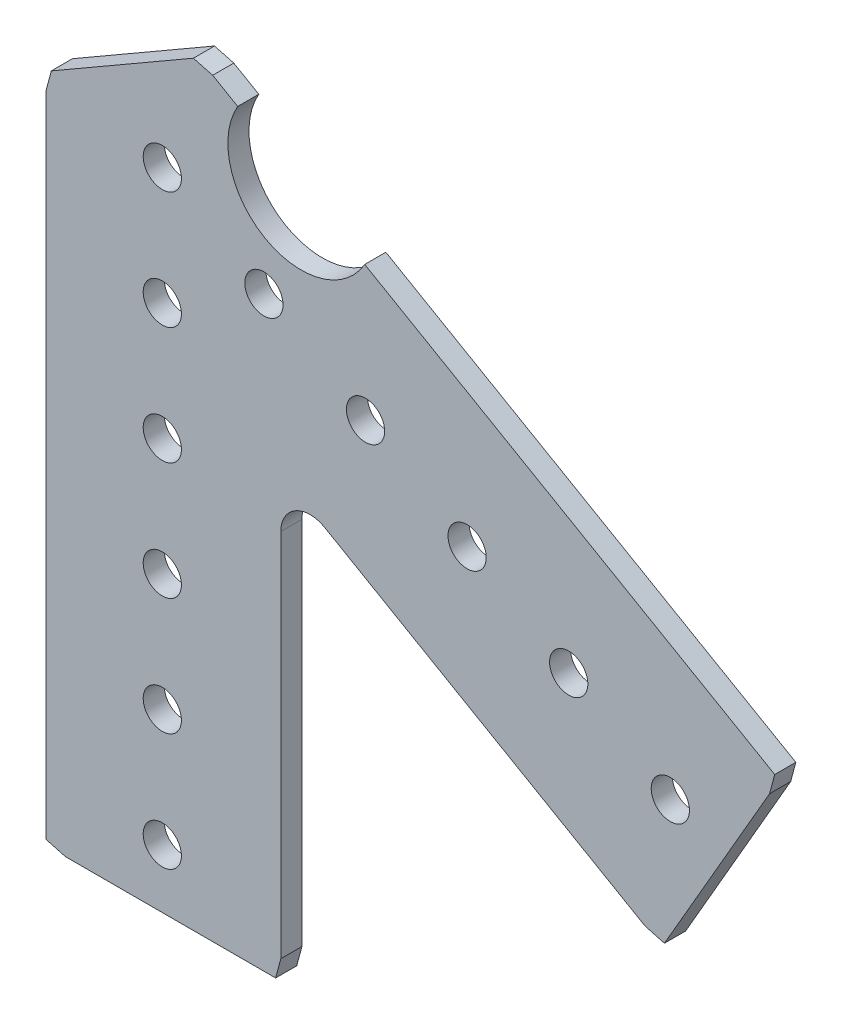
ISO-10303-21;
HEADER;
FILE_DESCRIPTION(('STEP AP214'),'2;1');
FILE_NAME('part.step','',(''),(''),'','','');
FILE_SCHEMA(('AUTOMOTIVE_DESIGN { 1 0 10303 214 1 1 1 1 }'));
ENDSEC;
DATA;
#1=APPLICATION_CONTEXT('core data for automotive mechanical design processes');
#2=APPLICATION_PROTOCOL_DEFINITION('international standard','automotive_design',2000,#1);
#3=PRODUCT_CONTEXT('',#1,'mechanical');
#4=PRODUCT('Part','Part','',(#3));
#5=PRODUCT_RELATED_PRODUCT_CATEGORY('part','',(#4));
#6=PRODUCT_DEFINITION_FORMATION('','',#4);
#7=PRODUCT_DEFINITION_CONTEXT('part definition',#1,'design');
#8=PRODUCT_DEFINITION('design','',#6,#7);
#9=PRODUCT_DEFINITION_SHAPE('','',#8);
#10=(LENGTH_UNIT() NAMED_UNIT(*) SI_UNIT(.MILLI.,.METRE.));
#11=(NAMED_UNIT(*) PLANE_ANGLE_UNIT() SI_UNIT($,.RADIAN.));
#12=(NAMED_UNIT(*) SI_UNIT($,.STERADIAN.) SOLID_ANGLE_UNIT());
#13=UNCERTAINTY_MEASURE_WITH_UNIT(LENGTH_MEASURE(1.E-05),#10,'distance_accuracy_value','');
#14=(GEOMETRIC_REPRESENTATION_CONTEXT(3) GLOBAL_UNCERTAINTY_ASSIGNED_CONTEXT((#13)) GLOBAL_UNIT_ASSIGNED_CONTEXT((#10,
#11,#12)) REPRESENTATION_CONTEXT('',''));
#15=CARTESIAN_POINT('',(0.,0.,0.));
#16=DIRECTION('',(0.,0.,1.));
#17=DIRECTION('',(1.,0.,0.));
#18=AXIS2_PLACEMENT_3D('',#15,#16,#17);
#19=CARTESIAN_POINT('',(66.7783744543378,-24.0364625982182,2.286));
#20=DIRECTION('',(0.,0.,1.));
#21=DIRECTION('',(1.,0.,0.));
#22=AXIS2_PLACEMENT_3D('',#19,#20,#21);
#23=PLANE('',#22);
#24=CARTESIAN_POINT('',(0.,-63.5,2.286));
#25=DIRECTION('',(0.,0.,-1.));
#26=DIRECTION('',(-1.,0.,0.));
#27=AXIS2_PLACEMENT_3D('',#24,#25,#26);
#28=CIRCLE('',#27,2.0701);
#29=CARTESIAN_POINT('',(-2.0701,-63.5,2.286));
#30=VERTEX_POINT('',#29);
#31=EDGE_CURVE('E262',#30,#30,#28,.T.);
#32=ORIENTED_EDGE('',*,*,#31,.T.);
#33=EDGE_LOOP('',(#32));
#34=FACE_BOUND('',#33,.T.);
#35=CARTESIAN_POINT('',(54.9926131403094,-31.75,2.286));
#36=DIRECTION('',(0.,0.,-1.));
#37=DIRECTION('',(-1.,0.,0.));
#38=AXIS2_PLACEMENT_3D('',#35,#36,#37);
#39=CIRCLE('',#38,2.0701);
#40=CARTESIAN_POINT('',(52.9225131403094,-31.75,2.286));
#41=VERTEX_POINT('',#40);
#42=EDGE_CURVE('E265',#41,#41,#39,.T.);
#43=ORIENTED_EDGE('',*,*,#42,.T.);
#44=EDGE_LOOP('',(#43));
#45=FACE_BOUND('',#44,.T.);
#46=CARTESIAN_POINT('',(32.9955678841958,-19.05,2.286));
#47=DIRECTION('',(0.,0.,-1.));
#48=DIRECTION('',(-1.,0.,0.));
#49=AXIS2_PLACEMENT_3D('',#46,#47,#48);
#50=CIRCLE('',#49,2.0701);
#51=CARTESIAN_POINT('',(30.9254678841958,-19.05,2.286));
#52=VERTEX_POINT('',#51);
#53=EDGE_CURVE('E268',#52,#52,#50,.T.);
#54=ORIENTED_EDGE('',*,*,#53,.T.);
#55=EDGE_LOOP('',(#54));
#56=FACE_BOUND('',#55,.T.);
#57=CARTESIAN_POINT('',(0.,-50.8,2.286));
#58=DIRECTION('',(0.,0.,-1.));
#59=DIRECTION('',(-1.,0.,0.));
#60=AXIS2_PLACEMENT_3D('',#57,#58,#59);
#61=CIRCLE('',#60,2.0701);
#62=CARTESIAN_POINT('',(-2.0701,-50.8,2.286));
#63=VERTEX_POINT('',#62);
#64=EDGE_CURVE('E271',#63,#63,#61,.T.);
#65=ORIENTED_EDGE('',*,*,#64,.T.);
#66=EDGE_LOOP('',(#65));
#67=FACE_BOUND('',#66,.T.);
#68=CARTESIAN_POINT('',(2.66050878019862E-13,-25.4,2.286));
#69=DIRECTION('',(0.,0.,-1.));
#70=DIRECTION('',(-1.,0.,0.));
#71=AXIS2_PLACEMENT_3D('',#68,#69,#70);
#72=CIRCLE('',#71,2.0701);
#73=CARTESIAN_POINT('',(-2.07009999999973,-25.4,2.286));
#74=VERTEX_POINT('',#73);
#75=EDGE_CURVE('E274',#74,#74,#72,.T.);
#76=ORIENTED_EDGE('',*,*,#75,.T.);
#77=EDGE_LOOP('',(#76));
#78=FACE_BOUND('',#77,.T.);
#79=CARTESIAN_POINT('',(10.9985226280619,-6.35,2.286));
#80=DIRECTION('',(0.,0.,-1.));
#81=DIRECTION('',(-1.,0.,0.));
#82=AXIS2_PLACEMENT_3D('',#79,#80,#81);
#83=CIRCLE('',#82,2.0701);
#84=CARTESIAN_POINT('',(8.92842262806188,-6.35,2.286));
#85=VERTEX_POINT('',#84);
#86=EDGE_CURVE('E277',#85,#85,#83,.T.);
#87=ORIENTED_EDGE('',*,*,#86,.T.);
#88=EDGE_LOOP('',(#87));
#89=FACE_BOUND('',#88,.T.);
#90=CARTESIAN_POINT('',(0.,0.,2.286));
#91=DIRECTION('',(0.,0.,-1.));
#92=DIRECTION('',(-1.,0.,0.));
#93=AXIS2_PLACEMENT_3D('',#90,#91,#92);
#94=CIRCLE('',#93,2.0701);
#95=CARTESIAN_POINT('',(-2.0701,0.,2.286));
#96=VERTEX_POINT('',#95);
#97=EDGE_CURVE('E280',#96,#96,#94,.T.);
#98=ORIENTED_EDGE('',*,*,#97,.T.);
#99=EDGE_LOOP('',(#98));
#100=FACE_BOUND('',#99,.T.);
#101=CARTESIAN_POINT('',(0.,-12.7,2.286));
#102=DIRECTION('',(0.,0.,-1.));
#103=DIRECTION('',(-1.,0.,0.));
#104=AXIS2_PLACEMENT_3D('',#101,#102,#103);
#105=CIRCLE('',#104,2.0701);
#106=CARTESIAN_POINT('',(-2.0701,-12.7,2.286));
#107=VERTEX_POINT('',#106);
#108=EDGE_CURVE('E283',#107,#107,#105,.T.);
#109=ORIENTED_EDGE('',*,*,#108,.T.);
#110=EDGE_LOOP('',(#109));
#111=FACE_BOUND('',#110,.T.);
#112=CARTESIAN_POINT('',(3.99076317029666E-13,-38.1,2.286));
#113=DIRECTION('',(0.,0.,-1.));
#114=DIRECTION('',(-1.,0.,0.));
#115=AXIS2_PLACEMENT_3D('',#112,#113,#114);
#116=CIRCLE('',#115,2.0701);
#117=CARTESIAN_POINT('',(-2.0700999999996,-38.1,2.286));
#118=VERTEX_POINT('',#117);
#119=EDGE_CURVE('E286',#118,#118,#116,.T.);
#120=ORIENTED_EDGE('',*,*,#119,.T.);
#121=EDGE_LOOP('',(#120));
#122=FACE_BOUND('',#121,.T.);
#123=CARTESIAN_POINT('',(21.9970452561238,-12.7,2.286));
#124=DIRECTION('',(0.,0.,-1.));
#125=DIRECTION('',(-1.,0.,0.));
#126=AXIS2_PLACEMENT_3D('',#123,#124,#125);
#127=CIRCLE('',#126,2.0701);
#128=CARTESIAN_POINT('',(19.9269452561238,-12.7,2.286));
#129=VERTEX_POINT('',#128);
#130=EDGE_CURVE('E146',#129,#129,#127,.T.);
#131=ORIENTED_EDGE('',*,*,#130,.T.);
#132=EDGE_LOOP('',(#131));
#133=FACE_BOUND('',#132,.T.);
#134=CARTESIAN_POINT('',(43.9940905122526,-25.4,2.286));
#135=DIRECTION('',(0.,0.,-1.));
#136=DIRECTION('',(-1.,0.,0.));
#137=AXIS2_PLACEMENT_3D('',#134,#135,#136);
#138=CIRCLE('',#137,2.0701);
#139=CARTESIAN_POINT('',(41.9239905122526,-25.4,2.286));
#140=VERTEX_POINT('',#139);
#141=EDGE_CURVE('E143',#140,#140,#138,.T.);
#142=ORIENTED_EDGE('',*,*,#141,.T.);
#143=EDGE_LOOP('',(#142));
#144=FACE_BOUND('',#143,.T.);
#145=DIRECTION('',(0.866025403784429,-0.500000000000017,0.));
#146=VECTOR('',#145,1.);
#147=CARTESIAN_POINT('',(3.92478394209282,12.2520748035636,2.286));
#148=LINE('',#147,#146);
#149=CARTESIAN_POINT('',(66.2944478432452,-23.7570674390337,2.286));
#150=VERTEX_POINT('',#149);
#151=CARTESIAN_POINT('',(21.9097236802746,1.86846500436471,2.286));
#152=VERTEX_POINT('',#151);
#153=EDGE_CURVE('E138',#150,#152,#148,.F.);
#154=ORIENTED_EDGE('',*,*,#153,.T.);
#155=CARTESIAN_POINT('',(15.0356470377365,5.83721500436554,2.286));
#156=DIRECTION('',(0.,0.,-1.));
#157=DIRECTION('',(-1.,0.,0.));
#158=AXIS2_PLACEMENT_3D('',#155,#156,#157);
#159=CIRCLE('',#158,7.9375);
#160=CARTESIAN_POINT('',(8.16157039519742,9.80596500436463,2.286));
#161=VERTEX_POINT('',#160);
#162=EDGE_CURVE('E19',#152,#161,#159,.T.);
#163=ORIENTED_EDGE('',*,*,#162,.T.);
#164=DIRECTION('',(0.866025403784429,-0.500000000000017,0.));
#165=VECTOR('',#164,1.);
#166=CARTESIAN_POINT('',(3.92478394209282,12.2520748035636,2.286));
#167=LINE('',#166,#165);
#168=CARTESIAN_POINT('',(5.45142748267607,11.3706667444522,2.286));
#169=VERTEX_POINT('',#168);
#170=EDGE_CURVE('E219',#161,#169,#167,.F.);
#171=ORIENTED_EDGE('',*,*,#170,.T.);
#172=DIRECTION('',(0.965925826289076,-0.258819045102493,0.));
#173=VECTOR('',#172,1.);
#174=CARTESIAN_POINT('',(3.2078430840089,11.9718333722264,2.286));
#175=LINE('',#174,#173);
#176=CARTESIAN_POINT('',(3.36599362371692,11.9294570628289,2.286));
#177=VERTEX_POINT('',#176);
#178=EDGE_CURVE('E216',#169,#177,#175,.F.);
#179=ORIENTED_EDGE('',*,*,#178,.T.);
#180=DIRECTION('',(0.866025403784429,0.500000000000017,0.));
#181=VECTOR('',#180,1.);
#182=CARTESIAN_POINT('',(-12.573,2.72707480356364,2.286));
#183=LINE('',#182,#181);
#184=CARTESIAN_POINT('',(-12.0142096816243,3.04969254429852,2.286));
#185=VERTEX_POINT('',#184);
#186=EDGE_CURVE('E211',#177,#185,#183,.F.);
#187=ORIENTED_EDGE('',*,*,#186,.T.);
#188=DIRECTION('',(-0.258819045102493,-0.965925826289076,0.));
#189=VECTOR('',#188,1.);
#190=CARTESIAN_POINT('',(-11.9718333722264,3.2078430840089,2.286));
#191=LINE('',#190,#189);
#192=CARTESIAN_POINT('',(-12.5730000000002,0.964258685340649,2.286));
#193=VERTEX_POINT('',#192);
#194=EDGE_CURVE('E205',#193,#185,#191,.F.);
#195=ORIENTED_EDGE('',*,*,#194,.F.);
#196=DIRECTION('',(0.,1.,0.));
#197=VECTOR('',#196,1.);
#198=CARTESIAN_POINT('',(-12.573,-69.85,2.286));
#199=LINE('',#198,#197);
#200=CARTESIAN_POINT('',(-12.5730000000013,-69.2912096816238,2.286));
#201=VERTEX_POINT('',#200);
#202=EDGE_CURVE('E197',#193,#201,#199,.F.);
#203=ORIENTED_EDGE('',*,*,#202,.T.);
#204=DIRECTION('',(-0.965925826289076,0.258819045102493,0.));
#205=VECTOR('',#204,1.);
#206=CARTESIAN_POINT('',(-18.1650337195145,-67.792828762433,2.286));
#207=LINE('',#206,#205);
#208=CARTESIAN_POINT('',(-10.4875661410412,-69.8500000000003,2.286));
#209=VERTEX_POINT('',#208);
#210=EDGE_CURVE('E194',#201,#209,#207,.F.);
#211=ORIENTED_EDGE('',*,*,#210,.T.);
#212=DIRECTION('',(1.,0.,0.));
#213=VECTOR('',#212,1.);
#214=CARTESIAN_POINT('',(12.827,-69.85,2.286));
#215=LINE('',#214,#213);
#216=CARTESIAN_POINT('',(12.2682096816262,-69.8500000000006,2.286));
#217=VERTEX_POINT('',#216);
#218=EDGE_CURVE('E188',#209,#217,#215,.T.);
#219=ORIENTED_EDGE('',*,*,#218,.T.);
#220=DIRECTION('',(0.258819045102493,0.965925826289076,0.));
#221=VECTOR('',#220,1.);
#222=CARTESIAN_POINT('',(28.9088954624338,-7.7461151932352,2.286));
#223=LINE('',#222,#221);
#224=CARTESIAN_POINT('',(12.8270000000021,-67.7645661410316,2.286));
#225=VERTEX_POINT('',#224);
#226=EDGE_CURVE('E182',#225,#217,#223,.F.);
#227=ORIENTED_EDGE('',*,*,#226,.F.);
#228=DIRECTION('',(0.,1.,0.));
#229=VECTOR('',#228,1.);
#230=CARTESIAN_POINT('',(12.827,0.,2.286));
#231=LINE('',#230,#229);
#232=CARTESIAN_POINT('',(12.827,-27.7162770227072,2.286));
#233=VERTEX_POINT('',#232);
#234=EDGE_CURVE('E175',#225,#233,#231,.T.);
#235=ORIENTED_EDGE('',*,*,#234,.T.);
#236=CARTESIAN_POINT('',(16.002,-27.7162770227072,2.286));
#237=DIRECTION('',(0.,0.,1.));
#238=DIRECTION('',(1.,0.,0.));
#239=AXIS2_PLACEMENT_3D('',#236,#237,#238);
#240=CIRCLE('',#239,3.175);
#241=CARTESIAN_POINT('',(17.5894999999973,-24.9666463657021,2.286));
#242=VERTEX_POINT('',#241);
#243=EDGE_CURVE('E178',#233,#242,#240,.F.);
#244=ORIENTED_EDGE('',*,*,#243,.T.);
#245=DIRECTION('',(0.866025403784429,-0.500000000000017,0.));
#246=VECTOR('',#245,1.);
#247=CARTESIAN_POINT('',(-6.4135,-11.1085078543445,2.286));
#248=LINE('',#247,#246);
#249=CARTESIAN_POINT('',(52.2723357545629,-44.9907909248614,2.286));
#250=VERTEX_POINT('',#249);
#251=EDGE_CURVE('E169',#250,#242,#248,.F.);
#252=ORIENTED_EDGE('',*,*,#251,.F.);
#253=DIRECTION('',(0.965925826289076,-0.258819045102493,0.));
#254=VECTOR('',#253,1.);
#255=CARTESIAN_POINT('',(-7.7461151932352,-28.9088954624338,2.286));
#256=LINE('',#255,#254);
#257=CARTESIAN_POINT('',(54.3577696135253,-45.5495812432447,2.286));
#258=VERTEX_POINT('',#257);
#259=EDGE_CURVE('E163',#258,#250,#256,.F.);
#260=ORIENTED_EDGE('',*,*,#259,.F.);
#261=DIRECTION('',(-0.500000000000017,-0.866025403784429,0.));
#262=VECTOR('',#261,1.);
#263=CARTESIAN_POINT('',(66.7783744543378,-24.0364625982182,2.286));
#264=LINE('',#263,#262);
#265=CARTESIAN_POINT('',(65.7356575248669,-25.8425012979777,2.286));
#266=VERTEX_POINT('',#265);
#267=EDGE_CURVE('E158',#258,#266,#264,.F.);
#268=ORIENTED_EDGE('',*,*,#267,.T.);
#269=DIRECTION('',(0.258819045102493,0.965925826289076,0.));
#270=VECTOR('',#269,1.);
#271=CARTESIAN_POINT('',(67.792828762433,-18.1650337195145,2.286));
#272=LINE('',#271,#270);
#273=EDGE_CURVE('E140',#150,#266,#272,.F.);
#274=ORIENTED_EDGE('',*,*,#273,.F.);
#275=EDGE_LOOP('',(#154,#163,#171,#179,#187,#195,#203,#211,#219,#227,#235,#244,#252,#260,#268,#274));
#276=FACE_BOUND('',#275,.T.);
#277=ADVANCED_FACE('F16',(#34,#45,#56,#67,#78,#89,#100,#111,#122,#133,#144,#276),#23,.T.);
#278=CARTESIAN_POINT('',(15.0356470377365,5.83721500436554,0.));
#279=DIRECTION('',(0.,0.,-1.));
#280=DIRECTION('',(-1.,0.,0.));
#281=AXIS2_PLACEMENT_3D('',#278,#279,#280);
#282=CYLINDRICAL_SURFACE('',#281,7.9375);
#283=ORIENTED_EDGE('',*,*,#162,.F.);
#284=DIRECTION('',(0.,0.,1.));
#285=VECTOR('',#284,1.);
#286=CARTESIAN_POINT('',(21.9097236802744,1.86846500436484,2.286));
#287=LINE('',#286,#285);
#288=CARTESIAN_POINT('',(21.9097236802747,1.8684650043648,0.));
#289=VERTEX_POINT('',#288);
#290=EDGE_CURVE('E131',#152,#289,#287,.F.);
#291=ORIENTED_EDGE('',*,*,#290,.T.);
#292=CARTESIAN_POINT('',(15.0356470377365,5.83721500436554,0.));
#293=DIRECTION('',(0.,0.,-1.));
#294=DIRECTION('',(-1.,0.,0.));
#295=AXIS2_PLACEMENT_3D('',#292,#293,#294);
#296=CIRCLE('',#295,7.9375);
#297=CARTESIAN_POINT('',(8.16157039519775,9.80596500436518,0.));
#298=VERTEX_POINT('',#297);
#299=EDGE_CURVE('E259',#289,#298,#296,.T.);
#300=ORIENTED_EDGE('',*,*,#299,.T.);
#301=DIRECTION('',(0.,0.,1.));
#302=VECTOR('',#301,1.);
#303=CARTESIAN_POINT('',(8.16157039519778,9.80596500436442,2.286));
#304=LINE('',#303,#302);
#305=EDGE_CURVE('E132',#298,#161,#304,.T.);
#306=ORIENTED_EDGE('',*,*,#305,.T.);
#307=EDGE_LOOP('',(#283,#291,#300,#306));
#308=FACE_BOUND('',#307,.T.);
#309=ADVANCED_FACE('F129',(#308),#282,.F.);
#310=CARTESIAN_POINT('',(3.92478394209282,12.2520748035636,2.286));
#311=DIRECTION('',(-0.500000000000017,-0.866025403784429,0.));
#312=DIRECTION('',(0.866025403784429,-0.500000000000017,0.));
#313=AXIS2_PLACEMENT_3D('',#310,#311,#312);
#314=PLANE('',#313);
#315=DIRECTION('',(0.,0.,1.));
#316=VECTOR('',#315,1.);
#317=CARTESIAN_POINT('',(5.45142748267626,11.3706667444525,0.));
#318=LINE('',#317,#316);
#319=CARTESIAN_POINT('',(5.45142748267588,11.3706667444511,0.));
#320=VERTEX_POINT('',#319);
#321=EDGE_CURVE('E218',#320,#169,#318,.T.);
#322=ORIENTED_EDGE('',*,*,#321,.T.);
#323=ORIENTED_EDGE('',*,*,#170,.F.);
#324=ORIENTED_EDGE('',*,*,#305,.F.);
#325=DIRECTION('',(-0.866025403784793,0.499999999999386,0.));
#326=VECTOR('',#325,1.);
#327=CARTESIAN_POINT('',(8.16157039519842,9.80596500436554,0.));
#328=LINE('',#327,#326);
#329=EDGE_CURVE('E261',#298,#320,#328,.T.);
#330=ORIENTED_EDGE('',*,*,#329,.T.);
#331=EDGE_LOOP('',(#322,#323,#324,#330));
#332=FACE_BOUND('',#331,.T.);
#333=ADVANCED_FACE('F365',(#332),#314,.F.);
#334=CARTESIAN_POINT('',(3.2078430840089,11.9718333722264,0.));
#335=DIRECTION('',(-0.258819045102493,-0.965925826289076,0.));
#336=DIRECTION('',(0.965925826289076,-0.258819045102493,0.));
#337=AXIS2_PLACEMENT_3D('',#334,#335,#336);
#338=PLANE('',#337);
#339=DIRECTION('',(-0.965925826288839,0.258819045103377,0.));
#340=VECTOR('',#339,1.);
#341=CARTESIAN_POINT('',(5.45142748267568,11.3706667444503,0.));
#342=LINE('',#341,#340);
#343=CARTESIAN_POINT('',(3.36599362371686,11.9294570628288,0.));
#344=VERTEX_POINT('',#343);
#345=EDGE_CURVE('E350',#320,#344,#342,.T.);
#346=ORIENTED_EDGE('',*,*,#345,.T.);
#347=DIRECTION('',(0.,0.,1.));
#348=VECTOR('',#347,1.);
#349=CARTESIAN_POINT('',(3.36599362371691,11.9294570628287,2.286));
#350=LINE('',#349,#348);
#351=EDGE_CURVE('E213',#344,#177,#350,.T.);
#352=ORIENTED_EDGE('',*,*,#351,.T.);
#353=ORIENTED_EDGE('',*,*,#178,.F.);
#354=ORIENTED_EDGE('',*,*,#321,.F.);
#355=EDGE_LOOP('',(#346,#352,#353,#354));
#356=FACE_BOUND('',#355,.T.);
#357=ADVANCED_FACE('F369',(#356),#338,.F.);
#358=CARTESIAN_POINT('',(-12.573,2.72707480356364,2.286));
#359=DIRECTION('',(0.500000000000017,-0.866025403784429,0.));
#360=DIRECTION('',(0.866025403784429,0.500000000000017,0.));
#361=AXIS2_PLACEMENT_3D('',#358,#359,#360);
#362=PLANE('',#361);
#363=ORIENTED_EDGE('',*,*,#351,.F.);
#364=DIRECTION('',(-0.866025403784421,-0.500000000000031,0.));
#365=VECTOR('',#364,1.);
#366=CARTESIAN_POINT('',(3.36599362371684,11.9294570628289,0.));
#367=LINE('',#366,#365);
#368=CARTESIAN_POINT('',(-12.0142096816241,3.04969254429845,0.));
#369=VERTEX_POINT('',#368);
#370=EDGE_CURVE('E342',#344,#369,#367,.T.);
#371=ORIENTED_EDGE('',*,*,#370,.T.);
#372=DIRECTION('',(0.,0.,1.));
#373=VECTOR('',#372,1.);
#374=CARTESIAN_POINT('',(-12.0142096816244,3.04969254429852,0.));
#375=LINE('',#374,#373);
#376=EDGE_CURVE('E208',#185,#369,#375,.F.);
#377=ORIENTED_EDGE('',*,*,#376,.F.);
#378=ORIENTED_EDGE('',*,*,#186,.F.);
#379=EDGE_LOOP('',(#363,#371,#377,#378));
#380=FACE_BOUND('',#379,.T.);
#381=ADVANCED_FACE('F378',(#380),#362,.F.);
#382=CARTESIAN_POINT('',(-11.9718333722264,3.2078430840089,0.));
#383=DIRECTION('',(-0.965925826289076,0.258819045102493,0.));
#384=DIRECTION('',(-0.258819045102493,-0.965925826289076,0.));
#385=AXIS2_PLACEMENT_3D('',#382,#383,#384);
#386=PLANE('',#385);
#387=DIRECTION('',(0.,0.,-1.));
#388=VECTOR('',#387,1.);
#389=CARTESIAN_POINT('',(-12.573,0.964258685340599,2.286));
#390=LINE('',#389,#388);
#391=CARTESIAN_POINT('',(-12.573,0.964258685340592,0.));
#392=VERTEX_POINT('',#391);
#393=EDGE_CURVE('E202',#392,#193,#390,.F.);
#394=ORIENTED_EDGE('',*,*,#393,.T.);
#395=ORIENTED_EDGE('',*,*,#194,.T.);
#396=ORIENTED_EDGE('',*,*,#376,.T.);
#397=DIRECTION('',(-0.258819045102396,-0.965925826289102,0.));
#398=VECTOR('',#397,1.);
#399=CARTESIAN_POINT('',(-12.014209681624,3.04969254429842,0.));
#400=LINE('',#399,#398);
#401=EDGE_CURVE('E333',#369,#392,#400,.T.);
#402=ORIENTED_EDGE('',*,*,#401,.T.);
#403=EDGE_LOOP('',(#394,#395,#396,#402));
#404=FACE_BOUND('',#403,.T.);
#405=ADVANCED_FACE('F382',(#404),#386,.T.);
#406=CARTESIAN_POINT('',(-12.573,-69.85,2.286));
#407=DIRECTION('',(1.,0.,0.));
#408=DIRECTION('',(0.,0.,-1.));
#409=AXIS2_PLACEMENT_3D('',#406,#407,#408);
#410=PLANE('',#409);
#411=ORIENTED_EDGE('',*,*,#202,.F.);
#412=ORIENTED_EDGE('',*,*,#393,.F.);
#413=DIRECTION('',(0.,1.,0.));
#414=VECTOR('',#413,1.);
#415=CARTESIAN_POINT('',(-12.573,-24.0364625982182,0.));
#416=LINE('',#415,#414);
#417=CARTESIAN_POINT('',(-12.5730000000007,-69.2912096816189,0.));
#418=VERTEX_POINT('',#417);
#419=EDGE_CURVE('E324',#392,#418,#416,.F.);
#420=ORIENTED_EDGE('',*,*,#419,.T.);
#421=DIRECTION('',(0.,0.,1.));
#422=VECTOR('',#421,1.);
#423=CARTESIAN_POINT('',(-12.573000000002,-69.2912096816238,0.));
#424=LINE('',#423,#422);
#425=EDGE_CURVE('E191',#418,#201,#424,.T.);
#426=ORIENTED_EDGE('',*,*,#425,.T.);
#427=EDGE_LOOP('',(#411,#412,#420,#426));
#428=FACE_BOUND('',#427,.T.);
#429=ADVANCED_FACE('F384',(#428),#410,.F.);
#430=CARTESIAN_POINT('',(-18.1650337195145,-67.792828762433,0.));
#431=DIRECTION('',(0.258819045102493,0.965925826289076,0.));
#432=DIRECTION('',(-0.965925826289076,0.258819045102493,0.));
#433=AXIS2_PLACEMENT_3D('',#430,#431,#432);
#434=PLANE('',#433);
#435=DIRECTION('',(0.965925826288251,-0.258819045105571,0.));
#436=VECTOR('',#435,1.);
#437=CARTESIAN_POINT('',(-12.573,-69.2912096816164,0.));
#438=LINE('',#437,#436);
#439=CARTESIAN_POINT('',(-10.4875661410412,-69.85,0.));
#440=VERTEX_POINT('',#439);
#441=EDGE_CURVE('E315',#418,#440,#438,.T.);
#442=ORIENTED_EDGE('',*,*,#441,.T.);
#443=DIRECTION('',(0.,0.,1.));
#444=VECTOR('',#443,1.);
#445=CARTESIAN_POINT('',(-10.4875661410412,-69.85,2.286));
#446=LINE('',#445,#444);
#447=EDGE_CURVE('E190',#440,#209,#446,.T.);
#448=ORIENTED_EDGE('',*,*,#447,.T.);
#449=ORIENTED_EDGE('',*,*,#210,.F.);
#450=ORIENTED_EDGE('',*,*,#425,.F.);
#451=EDGE_LOOP('',(#442,#448,#449,#450));
#452=FACE_BOUND('',#451,.T.);
#453=ADVANCED_FACE('F389',(#452),#434,.F.);
#454=CARTESIAN_POINT('',(12.827,-69.85,2.286));
#455=DIRECTION('',(0.,1.,0.));
#456=DIRECTION('',(0.,0.,1.));
#457=AXIS2_PLACEMENT_3D('',#454,#455,#456);
#458=PLANE('',#457);
#459=DIRECTION('',(1.,0.,0.));
#460=VECTOR('',#459,1.);
#461=CARTESIAN_POINT('',(66.7783744543378,-69.85,0.));
#462=LINE('',#461,#460);
#463=CARTESIAN_POINT('',(12.2682096816251,-69.8500000000003,0.));
#464=VERTEX_POINT('',#463);
#465=EDGE_CURVE('E307',#440,#464,#462,.T.);
#466=ORIENTED_EDGE('',*,*,#465,.T.);
#467=DIRECTION('',(0.,0.,1.));
#468=VECTOR('',#467,1.);
#469=CARTESIAN_POINT('',(12.2682096816273,-69.8500000000009,0.));
#470=LINE('',#469,#468);
#471=EDGE_CURVE('E185',#217,#464,#470,.F.);
#472=ORIENTED_EDGE('',*,*,#471,.F.);
#473=ORIENTED_EDGE('',*,*,#218,.F.);
#474=ORIENTED_EDGE('',*,*,#447,.F.);
#475=EDGE_LOOP('',(#466,#472,#473,#474));
#476=FACE_BOUND('',#475,.T.);
#477=ADVANCED_FACE('F394',(#476),#458,.F.);
#478=CARTESIAN_POINT('',(28.9088954624338,-7.7461151932352,0.));
#479=DIRECTION('',(0.965925826289076,-0.258819045102493,0.));
#480=DIRECTION('',(0.258819045102493,0.965925826289076,0.));
#481=AXIS2_PLACEMENT_3D('',#478,#479,#480);
#482=PLANE('',#481);
#483=DIRECTION('',(0.,0.,1.));
#484=VECTOR('',#483,1.);
#485=CARTESIAN_POINT('',(12.827,-67.764566141031,0.));
#486=LINE('',#485,#484);
#487=CARTESIAN_POINT('',(12.827,-67.764566141031,0.));
#488=VERTEX_POINT('',#487);
#489=EDGE_CURVE('E179',#488,#225,#486,.T.);
#490=ORIENTED_EDGE('',*,*,#489,.T.);
#491=ORIENTED_EDGE('',*,*,#226,.T.);
#492=ORIENTED_EDGE('',*,*,#471,.T.);
#493=DIRECTION('',(0.258819045101101,0.965925826289449,0.));
#494=VECTOR('',#493,1.);
#495=CARTESIAN_POINT('',(12.268209681624,-69.85,0.));
#496=LINE('',#495,#494);
#497=EDGE_CURVE('E304',#464,#488,#496,.T.);
#498=ORIENTED_EDGE('',*,*,#497,.T.);
#499=EDGE_LOOP('',(#490,#491,#492,#498));
#500=FACE_BOUND('',#499,.T.);
#501=ADVANCED_FACE('F393',(#500),#482,.T.);
#502=CARTESIAN_POINT('',(12.827,0.,0.));
#503=DIRECTION('',(-1.,0.,0.));
#504=DIRECTION('',(0.,0.,1.));
#505=AXIS2_PLACEMENT_3D('',#502,#503,#504);
#506=PLANE('',#505);
#507=DIRECTION('',(0.,0.,1.));
#508=VECTOR('',#507,1.);
#509=CARTESIAN_POINT('',(12.827,-27.7162770227072,0.));
#510=LINE('',#509,#508);
#511=CARTESIAN_POINT('',(12.827,-27.7162770227072,0.));
#512=VERTEX_POINT('',#511);
#513=EDGE_CURVE('E172',#512,#233,#510,.T.);
#514=ORIENTED_EDGE('',*,*,#513,.T.);
#515=ORIENTED_EDGE('',*,*,#234,.F.);
#516=ORIENTED_EDGE('',*,*,#489,.F.);
#517=DIRECTION('',(0.,1.,0.));
#518=VECTOR('',#517,1.);
#519=CARTESIAN_POINT('',(12.827,-24.0364625982182,0.));
#520=LINE('',#519,#518);
#521=EDGE_CURVE('E258',#488,#512,#520,.T.);
#522=ORIENTED_EDGE('',*,*,#521,.T.);
#523=EDGE_LOOP('',(#514,#515,#516,#522));
#524=FACE_BOUND('',#523,.T.);
#525=ADVANCED_FACE('F402',(#524),#506,.F.);
#526=CARTESIAN_POINT('',(16.002,-27.7162770227072,0.));
#527=DIRECTION('',(0.,0.,1.));
#528=DIRECTION('',(1.,0.,0.));
#529=AXIS2_PLACEMENT_3D('',#526,#527,#528);
#530=CYLINDRICAL_SURFACE('',#529,3.175);
#531=CARTESIAN_POINT('',(16.002,-27.7162770227072,0.));
#532=DIRECTION('',(0.,0.,1.));
#533=DIRECTION('',(1.,0.,0.));
#534=AXIS2_PLACEMENT_3D('',#531,#532,#533);
#535=CIRCLE('',#534,3.175);
#536=CARTESIAN_POINT('',(17.5894999999977,-24.9666463657021,0.));
#537=VERTEX_POINT('',#536);
#538=EDGE_CURVE('E254',#512,#537,#535,.F.);
#539=ORIENTED_EDGE('',*,*,#538,.T.);
#540=DIRECTION('',(0.,0.,1.));
#541=VECTOR('',#540,1.);
#542=CARTESIAN_POINT('',(17.5894999999998,-24.9666463657036,0.));
#543=LINE('',#542,#541);
#544=EDGE_CURVE('E171',#242,#537,#543,.F.);
#545=ORIENTED_EDGE('',*,*,#544,.F.);
#546=ORIENTED_EDGE('',*,*,#243,.F.);
#547=ORIENTED_EDGE('',*,*,#513,.F.);
#548=EDGE_LOOP('',(#539,#545,#546,#547));
#549=FACE_BOUND('',#548,.T.);
#550=ADVANCED_FACE('F474',(#549),#530,.F.);
#551=CARTESIAN_POINT('',(-6.4135,-11.1085078543445,0.));
#552=DIRECTION('',(-0.500000000000017,-0.866025403784429,0.));
#553=DIRECTION('',(0.866025403784429,-0.500000000000017,0.));
#554=AXIS2_PLACEMENT_3D('',#551,#552,#553);
#555=PLANE('',#554);
#556=ORIENTED_EDGE('',*,*,#544,.T.);
#557=DIRECTION('',(0.866025403784338,-0.500000000000174,0.));
#558=VECTOR('',#557,1.);
#559=CARTESIAN_POINT('',(17.5895,-24.9666463657032,0.));
#560=LINE('',#559,#558);
#561=CARTESIAN_POINT('',(52.2723357545612,-44.9907909248655,0.));
#562=VERTEX_POINT('',#561);
#563=EDGE_CURVE('E257',#537,#562,#560,.T.);
#564=ORIENTED_EDGE('',*,*,#563,.T.);
#565=DIRECTION('',(0.,0.,1.));
#566=VECTOR('',#565,1.);
#567=CARTESIAN_POINT('',(52.2723357545623,-44.9907909248613,0.));
#568=LINE('',#567,#566);
#569=EDGE_CURVE('E166',#250,#562,#568,.F.);
#570=ORIENTED_EDGE('',*,*,#569,.F.);
#571=ORIENTED_EDGE('',*,*,#251,.T.);
#572=EDGE_LOOP('',(#556,#564,#570,#571));
#573=FACE_BOUND('',#572,.T.);
#574=ADVANCED_FACE('F470',(#573),#555,.T.);
#575=CARTESIAN_POINT('',(-7.7461151932352,-28.9088954624338,0.));
#576=DIRECTION('',(-0.258819045102493,-0.965925826289076,0.));
#577=DIRECTION('',(0.965925826289076,-0.258819045102493,0.));
#578=AXIS2_PLACEMENT_3D('',#575,#576,#577);
#579=PLANE('',#578);
#580=DIRECTION('',(0.,0.,1.));
#581=VECTOR('',#580,1.);
#582=CARTESIAN_POINT('',(54.3577696135217,-45.5495812432466,2.286));
#583=LINE('',#582,#581);
#584=CARTESIAN_POINT('',(54.357769613527,-45.5495812432497,0.));
#585=VERTEX_POINT('',#584);
#586=EDGE_CURVE('E160',#585,#258,#583,.T.);
#587=ORIENTED_EDGE('',*,*,#586,.T.);
#588=ORIENTED_EDGE('',*,*,#259,.T.);
#589=ORIENTED_EDGE('',*,*,#569,.T.);
#590=DIRECTION('',(0.965925826288567,-0.258819045104392,0.));
#591=VECTOR('',#590,1.);
#592=CARTESIAN_POINT('',(52.2723357545606,-44.9907909248676,0.));
#593=LINE('',#592,#591);
#594=EDGE_CURVE('E730',#562,#585,#593,.T.);
#595=ORIENTED_EDGE('',*,*,#594,.T.);
#596=EDGE_LOOP('',(#587,#588,#589,#595));
#597=FACE_BOUND('',#596,.T.);
#598=ADVANCED_FACE('F466',(#597),#579,.T.);
#599=CARTESIAN_POINT('',(66.7783744543378,-24.0364625982182,2.286));
#600=DIRECTION('',(-0.866025403784429,0.500000000000017,0.));
#601=DIRECTION('',(-0.500000000000017,-0.866025403784429,0.));
#602=AXIS2_PLACEMENT_3D('',#599,#600,#601);
#603=PLANE('',#602);
#604=ORIENTED_EDGE('',*,*,#586,.F.);
#605=DIRECTION('',(0.499999999999711,0.866025403784606,0.));
#606=VECTOR('',#605,1.);
#607=CARTESIAN_POINT('',(54.3577696135296,-45.5495812432512,0.));
#608=LINE('',#607,#606);
#609=CARTESIAN_POINT('',(65.7356575248666,-25.8425012979777,0.));
#610=VERTEX_POINT('',#609);
#611=EDGE_CURVE('E722',#585,#610,#608,.T.);
#612=ORIENTED_EDGE('',*,*,#611,.T.);
#613=DIRECTION('',(0.,0.,1.));
#614=VECTOR('',#613,1.);
#615=CARTESIAN_POINT('',(65.7356575248678,-25.8425012979781,0.));
#616=LINE('',#615,#614);
#617=EDGE_CURVE('E155',#266,#610,#616,.F.);
#618=ORIENTED_EDGE('',*,*,#617,.F.);
#619=ORIENTED_EDGE('',*,*,#267,.F.);
#620=EDGE_LOOP('',(#604,#612,#618,#619));
#621=FACE_BOUND('',#620,.T.);
#622=ADVANCED_FACE('F462',(#621),#603,.F.);
#623=CARTESIAN_POINT('',(67.792828762433,-18.1650337195145,0.));
#624=DIRECTION('',(0.965925826289076,-0.258819045102493,0.));
#625=DIRECTION('',(0.258819045102493,0.965925826289076,0.));
#626=AXIS2_PLACEMENT_3D('',#623,#624,#625);
#627=PLANE('',#626);
#628=DIRECTION('',(0.,0.,1.));
#629=VECTOR('',#628,1.);
#630=CARTESIAN_POINT('',(66.2944478432471,-23.7570674390359,2.286));
#631=LINE('',#630,#629);
#632=CARTESIAN_POINT('',(66.2944478432487,-23.7570674390329,0.));
#633=VERTEX_POINT('',#632);
#634=EDGE_CURVE('E34',#633,#150,#631,.T.);
#635=ORIENTED_EDGE('',*,*,#634,.T.);
#636=ORIENTED_EDGE('',*,*,#273,.T.);
#637=ORIENTED_EDGE('',*,*,#617,.T.);
#638=DIRECTION('',(0.258819045107036,0.965925826287858,0.));
#639=VECTOR('',#638,1.);
#640=CARTESIAN_POINT('',(65.735657524866,-25.8425012979776,0.));
#641=LINE('',#640,#639);
#642=EDGE_CURVE('E719',#610,#633,#641,.T.);
#643=ORIENTED_EDGE('',*,*,#642,.T.);
#644=EDGE_LOOP('',(#635,#636,#637,#643));
#645=FACE_BOUND('',#644,.T.);
#646=ADVANCED_FACE('F459',(#645),#627,.T.);
#647=CARTESIAN_POINT('',(3.92478394209282,12.2520748035636,2.286));
#648=DIRECTION('',(-0.500000000000017,-0.866025403784429,0.));
#649=DIRECTION('',(0.866025403784429,-0.500000000000017,0.));
#650=AXIS2_PLACEMENT_3D('',#647,#648,#649);
#651=PLANE('',#650);
#652=ORIENTED_EDGE('',*,*,#634,.F.);
#653=DIRECTION('',(-0.866025403784476,0.499999999999935,0.));
#654=VECTOR('',#653,1.);
#655=CARTESIAN_POINT('',(66.2944478432496,-23.7570674390315,0.));
#656=LINE('',#655,#654);
#657=EDGE_CURVE('E139',#633,#289,#656,.T.);
#658=ORIENTED_EDGE('',*,*,#657,.T.);
#659=ORIENTED_EDGE('',*,*,#290,.F.);
#660=ORIENTED_EDGE('',*,*,#153,.F.);
#661=EDGE_LOOP('',(#652,#658,#659,#660));
#662=FACE_BOUND('',#661,.T.);
#663=ADVANCED_FACE('F137',(#662),#651,.F.);
#664=CARTESIAN_POINT('',(43.9940905122526,-25.4,2.286));
#665=DIRECTION('',(0.,0.,-1.));
#666=DIRECTION('',(-1.,0.,0.));
#667=AXIS2_PLACEMENT_3D('',#664,#665,#666);
#668=CYLINDRICAL_SURFACE('',#667,2.0701);
#669=CARTESIAN_POINT('',(43.9940905122526,-25.4,0.));
#670=DIRECTION('',(0.,0.,-1.));
#671=DIRECTION('',(-1.,0.,0.));
#672=AXIS2_PLACEMENT_3D('',#669,#670,#671);
#673=CIRCLE('',#672,2.0701);
#674=CARTESIAN_POINT('',(41.9239905122526,-25.4,0.));
#675=VERTEX_POINT('',#674);
#676=EDGE_CURVE('E251',#675,#675,#673,.T.);
#677=ORIENTED_EDGE('',*,*,#676,.T.);
#678=EDGE_LOOP('',(#677));
#679=FACE_BOUND('',#678,.T.);
#680=ORIENTED_EDGE('',*,*,#141,.F.);
#681=EDGE_LOOP('',(#680));
#682=FACE_BOUND('',#681,.T.);
#683=ADVANCED_FACE('F452',(#679,#682),#668,.F.);
#684=CARTESIAN_POINT('',(21.9970452561238,-12.7,2.286));
#685=DIRECTION('',(0.,0.,-1.));
#686=DIRECTION('',(-1.,0.,0.));
#687=AXIS2_PLACEMENT_3D('',#684,#685,#686);
#688=CYLINDRICAL_SURFACE('',#687,2.0701);
#689=CARTESIAN_POINT('',(21.9970452561238,-12.7,0.));
#690=DIRECTION('',(0.,0.,-1.));
#691=DIRECTION('',(-1.,0.,0.));
#692=AXIS2_PLACEMENT_3D('',#689,#690,#691);
#693=CIRCLE('',#692,2.0701);
#694=CARTESIAN_POINT('',(19.9269452561238,-12.7,0.));
#695=VERTEX_POINT('',#694);
#696=EDGE_CURVE('E248',#695,#695,#693,.T.);
#697=ORIENTED_EDGE('',*,*,#696,.T.);
#698=EDGE_LOOP('',(#697));
#699=FACE_BOUND('',#698,.T.);
#700=ORIENTED_EDGE('',*,*,#130,.F.);
#701=EDGE_LOOP('',(#700));
#702=FACE_BOUND('',#701,.T.);
#703=ADVANCED_FACE('F448',(#699,#702),#688,.F.);
#704=CARTESIAN_POINT('',(3.99076317029666E-13,-38.1,2.286));
#705=DIRECTION('',(0.,0.,-1.));
#706=DIRECTION('',(-1.,0.,0.));
#707=AXIS2_PLACEMENT_3D('',#704,#705,#706);
#708=CYLINDRICAL_SURFACE('',#707,2.0701);
#709=CARTESIAN_POINT('',(3.99076317029666E-13,-38.1,0.));
#710=DIRECTION('',(0.,0.,-1.));
#711=DIRECTION('',(-1.,0.,0.));
#712=AXIS2_PLACEMENT_3D('',#709,#710,#711);
#713=CIRCLE('',#712,2.0701);
#714=CARTESIAN_POINT('',(-2.0700999999996,-38.1,0.));
#715=VERTEX_POINT('',#714);
#716=EDGE_CURVE('E245',#715,#715,#713,.T.);
#717=ORIENTED_EDGE('',*,*,#716,.T.);
#718=EDGE_LOOP('',(#717));
#719=FACE_BOUND('',#718,.T.);
#720=ORIENTED_EDGE('',*,*,#119,.F.);
#721=EDGE_LOOP('',(#720));
#722=FACE_BOUND('',#721,.T.);
#723=ADVANCED_FACE('F444',(#719,#722),#708,.F.);
#724=CARTESIAN_POINT('',(0.,-12.7,2.286));
#725=DIRECTION('',(0.,0.,-1.));
#726=DIRECTION('',(-1.,0.,0.));
#727=AXIS2_PLACEMENT_3D('',#724,#725,#726);
#728=CYLINDRICAL_SURFACE('',#727,2.0701);
#729=CARTESIAN_POINT('',(0.,-12.7,0.));
#730=DIRECTION('',(0.,0.,-1.));
#731=DIRECTION('',(-1.,0.,0.));
#732=AXIS2_PLACEMENT_3D('',#729,#730,#731);
#733=CIRCLE('',#732,2.0701);
#734=CARTESIAN_POINT('',(-2.0701,-12.7,0.));
#735=VERTEX_POINT('',#734);
#736=EDGE_CURVE('E242',#735,#735,#733,.T.);
#737=ORIENTED_EDGE('',*,*,#736,.T.);
#738=EDGE_LOOP('',(#737));
#739=FACE_BOUND('',#738,.T.);
#740=ORIENTED_EDGE('',*,*,#108,.F.);
#741=EDGE_LOOP('',(#740));
#742=FACE_BOUND('',#741,.T.);
#743=ADVANCED_FACE('F440',(#739,#742),#728,.F.);
#744=CARTESIAN_POINT('',(0.,0.,2.286));
#745=DIRECTION('',(0.,0.,-1.));
#746=DIRECTION('',(-1.,0.,0.));
#747=AXIS2_PLACEMENT_3D('',#744,#745,#746);
#748=CYLINDRICAL_SURFACE('',#747,2.0701);
#749=CARTESIAN_POINT('',(0.,0.,0.));
#750=DIRECTION('',(0.,0.,-1.));
#751=DIRECTION('',(-1.,0.,0.));
#752=AXIS2_PLACEMENT_3D('',#749,#750,#751);
#753=CIRCLE('',#752,2.0701);
#754=CARTESIAN_POINT('',(-2.0701,0.,0.));
#755=VERTEX_POINT('',#754);
#756=EDGE_CURVE('E239',#755,#755,#753,.T.);
#757=ORIENTED_EDGE('',*,*,#756,.T.);
#758=EDGE_LOOP('',(#757));
#759=FACE_BOUND('',#758,.T.);
#760=ORIENTED_EDGE('',*,*,#97,.F.);
#761=EDGE_LOOP('',(#760));
#762=FACE_BOUND('',#761,.T.);
#763=ADVANCED_FACE('F436',(#759,#762),#748,.F.);
#764=CARTESIAN_POINT('',(10.9985226280619,-6.35,2.286));
#765=DIRECTION('',(0.,0.,-1.));
#766=DIRECTION('',(-1.,0.,0.));
#767=AXIS2_PLACEMENT_3D('',#764,#765,#766);
#768=CYLINDRICAL_SURFACE('',#767,2.0701);
#769=CARTESIAN_POINT('',(10.9985226280619,-6.35,0.));
#770=DIRECTION('',(0.,0.,-1.));
#771=DIRECTION('',(-1.,0.,0.));
#772=AXIS2_PLACEMENT_3D('',#769,#770,#771);
#773=CIRCLE('',#772,2.0701);
#774=CARTESIAN_POINT('',(8.92842262806188,-6.35,0.));
#775=VERTEX_POINT('',#774);
#776=EDGE_CURVE('E236',#775,#775,#773,.T.);
#777=ORIENTED_EDGE('',*,*,#776,.T.);
#778=EDGE_LOOP('',(#777));
#779=FACE_BOUND('',#778,.T.);
#780=ORIENTED_EDGE('',*,*,#86,.F.);
#781=EDGE_LOOP('',(#780));
#782=FACE_BOUND('',#781,.T.);
#783=ADVANCED_FACE('F432',(#779,#782),#768,.F.);
#784=CARTESIAN_POINT('',(2.66050878019862E-13,-25.4,2.286));
#785=DIRECTION('',(0.,0.,-1.));
#786=DIRECTION('',(-1.,0.,0.));
#787=AXIS2_PLACEMENT_3D('',#784,#785,#786);
#788=CYLINDRICAL_SURFACE('',#787,2.0701);
#789=CARTESIAN_POINT('',(2.66050878019862E-13,-25.4,0.));
#790=DIRECTION('',(0.,0.,-1.));
#791=DIRECTION('',(-1.,0.,0.));
#792=AXIS2_PLACEMENT_3D('',#789,#790,#791);
#793=CIRCLE('',#792,2.0701);
#794=CARTESIAN_POINT('',(-2.07009999999973,-25.4,0.));
#795=VERTEX_POINT('',#794);
#796=EDGE_CURVE('E233',#795,#795,#793,.T.);
#797=ORIENTED_EDGE('',*,*,#796,.T.);
#798=EDGE_LOOP('',(#797));
#799=FACE_BOUND('',#798,.T.);
#800=ORIENTED_EDGE('',*,*,#75,.F.);
#801=EDGE_LOOP('',(#800));
#802=FACE_BOUND('',#801,.T.);
#803=ADVANCED_FACE('F428',(#799,#802),#788,.F.);
#804=CARTESIAN_POINT('',(0.,-50.8,2.286));
#805=DIRECTION('',(0.,0.,-1.));
#806=DIRECTION('',(-1.,0.,0.));
#807=AXIS2_PLACEMENT_3D('',#804,#805,#806);
#808=CYLINDRICAL_SURFACE('',#807,2.0701);
#809=CARTESIAN_POINT('',(0.,-50.8,0.));
#810=DIRECTION('',(0.,0.,-1.));
#811=DIRECTION('',(-1.,0.,0.));
#812=AXIS2_PLACEMENT_3D('',#809,#810,#811);
#813=CIRCLE('',#812,2.0701);
#814=CARTESIAN_POINT('',(-2.0701,-50.8,0.));
#815=VERTEX_POINT('',#814);
#816=EDGE_CURVE('E230',#815,#815,#813,.T.);
#817=ORIENTED_EDGE('',*,*,#816,.T.);
#818=EDGE_LOOP('',(#817));
#819=FACE_BOUND('',#818,.T.);
#820=ORIENTED_EDGE('',*,*,#64,.F.);
#821=EDGE_LOOP('',(#820));
#822=FACE_BOUND('',#821,.T.);
#823=ADVANCED_FACE('F424',(#819,#822),#808,.F.);
#824=CARTESIAN_POINT('',(32.9955678841958,-19.05,2.286));
#825=DIRECTION('',(0.,0.,-1.));
#826=DIRECTION('',(-1.,0.,0.));
#827=AXIS2_PLACEMENT_3D('',#824,#825,#826);
#828=CYLINDRICAL_SURFACE('',#827,2.0701);
#829=CARTESIAN_POINT('',(32.9955678841958,-19.05,0.));
#830=DIRECTION('',(0.,0.,-1.));
#831=DIRECTION('',(-1.,0.,0.));
#832=AXIS2_PLACEMENT_3D('',#829,#830,#831);
#833=CIRCLE('',#832,2.0701);
#834=CARTESIAN_POINT('',(30.9254678841958,-19.05,0.));
#835=VERTEX_POINT('',#834);
#836=EDGE_CURVE('E227',#835,#835,#833,.T.);
#837=ORIENTED_EDGE('',*,*,#836,.T.);
#838=EDGE_LOOP('',(#837));
#839=FACE_BOUND('',#838,.T.);
#840=ORIENTED_EDGE('',*,*,#53,.F.);
#841=EDGE_LOOP('',(#840));
#842=FACE_BOUND('',#841,.T.);
#843=ADVANCED_FACE('F420',(#839,#842),#828,.F.);
#844=CARTESIAN_POINT('',(54.9926131403094,-31.75,2.286));
#845=DIRECTION('',(0.,0.,-1.));
#846=DIRECTION('',(-1.,0.,0.));
#847=AXIS2_PLACEMENT_3D('',#844,#845,#846);
#848=CYLINDRICAL_SURFACE('',#847,2.0701);
#849=CARTESIAN_POINT('',(54.9926131403094,-31.75,0.));
#850=DIRECTION('',(0.,0.,-1.));
#851=DIRECTION('',(-1.,0.,0.));
#852=AXIS2_PLACEMENT_3D('',#849,#850,#851);
#853=CIRCLE('',#852,2.0701);
#854=CARTESIAN_POINT('',(52.9225131403094,-31.75,0.));
#855=VERTEX_POINT('',#854);
#856=EDGE_CURVE('E25',#855,#855,#853,.T.);
#857=ORIENTED_EDGE('',*,*,#856,.T.);
#858=EDGE_LOOP('',(#857));
#859=FACE_BOUND('',#858,.T.);
#860=ORIENTED_EDGE('',*,*,#42,.F.);
#861=EDGE_LOOP('',(#860));
#862=FACE_BOUND('',#861,.T.);
#863=ADVANCED_FACE('F412',(#859,#862),#848,.F.);
#864=CARTESIAN_POINT('',(0.,-63.5,2.286));
#865=DIRECTION('',(0.,0.,-1.));
#866=DIRECTION('',(-1.,0.,0.));
#867=AXIS2_PLACEMENT_3D('',#864,#865,#866);
#868=CYLINDRICAL_SURFACE('',#867,2.0701);
#869=CARTESIAN_POINT('',(0.,-63.5,0.));
#870=DIRECTION('',(0.,0.,-1.));
#871=DIRECTION('',(-1.,0.,0.));
#872=AXIS2_PLACEMENT_3D('',#869,#870,#871);
#873=CIRCLE('',#872,2.0701);
#874=CARTESIAN_POINT('',(-2.0701,-63.5,0.));
#875=VERTEX_POINT('',#874);
#876=EDGE_CURVE('E11',#875,#875,#873,.T.);
#877=ORIENTED_EDGE('',*,*,#876,.T.);
#878=EDGE_LOOP('',(#877));
#879=FACE_BOUND('',#878,.T.);
#880=ORIENTED_EDGE('',*,*,#31,.F.);
#881=EDGE_LOOP('',(#880));
#882=FACE_BOUND('',#881,.T.);
#883=ADVANCED_FACE('F406',(#879,#882),#868,.F.);
#884=CARTESIAN_POINT('',(66.7783744543378,-24.0364625982182,0.));
#885=DIRECTION('',(0.,0.,1.));
#886=DIRECTION('',(1.,0.,0.));
#887=AXIS2_PLACEMENT_3D('',#884,#885,#886);
#888=PLANE('',#887);
#889=ORIENTED_EDGE('',*,*,#876,.F.);
#890=EDGE_LOOP('',(#889));
#891=FACE_BOUND('',#890,.T.);
#892=ORIENTED_EDGE('',*,*,#856,.F.);
#893=EDGE_LOOP('',(#892));
#894=FACE_BOUND('',#893,.T.);
#895=ORIENTED_EDGE('',*,*,#836,.F.);
#896=EDGE_LOOP('',(#895));
#897=FACE_BOUND('',#896,.T.);
#898=ORIENTED_EDGE('',*,*,#816,.F.);
#899=EDGE_LOOP('',(#898));
#900=FACE_BOUND('',#899,.T.);
#901=ORIENTED_EDGE('',*,*,#796,.F.);
#902=EDGE_LOOP('',(#901));
#903=FACE_BOUND('',#902,.T.);
#904=ORIENTED_EDGE('',*,*,#776,.F.);
#905=EDGE_LOOP('',(#904));
#906=FACE_BOUND('',#905,.T.);
#907=ORIENTED_EDGE('',*,*,#756,.F.);
#908=EDGE_LOOP('',(#907));
#909=FACE_BOUND('',#908,.T.);
#910=ORIENTED_EDGE('',*,*,#736,.F.);
#911=EDGE_LOOP('',(#910));
#912=FACE_BOUND('',#911,.T.);
#913=ORIENTED_EDGE('',*,*,#716,.F.);
#914=EDGE_LOOP('',(#913));
#915=FACE_BOUND('',#914,.T.);
#916=ORIENTED_EDGE('',*,*,#696,.F.);
#917=EDGE_LOOP('',(#916));
#918=FACE_BOUND('',#917,.T.);
#919=ORIENTED_EDGE('',*,*,#676,.F.);
#920=EDGE_LOOP('',(#919));
#921=FACE_BOUND('',#920,.T.);
#922=ORIENTED_EDGE('',*,*,#642,.F.);
#923=ORIENTED_EDGE('',*,*,#611,.F.);
#924=ORIENTED_EDGE('',*,*,#594,.F.);
#925=ORIENTED_EDGE('',*,*,#563,.F.);
#926=ORIENTED_EDGE('',*,*,#538,.F.);
#927=ORIENTED_EDGE('',*,*,#521,.F.);
#928=ORIENTED_EDGE('',*,*,#497,.F.);
#929=ORIENTED_EDGE('',*,*,#465,.F.);
#930=ORIENTED_EDGE('',*,*,#441,.F.);
#931=ORIENTED_EDGE('',*,*,#419,.F.);
#932=ORIENTED_EDGE('',*,*,#401,.F.);
#933=ORIENTED_EDGE('',*,*,#370,.F.);
#934=ORIENTED_EDGE('',*,*,#345,.F.);
#935=ORIENTED_EDGE('',*,*,#329,.F.);
#936=ORIENTED_EDGE('',*,*,#299,.F.);
#937=ORIENTED_EDGE('',*,*,#657,.F.);
#938=EDGE_LOOP('',(#922,#923,#924,#925,#926,#927,#928,#929,#930,#931,#932,#933,#934,#935,#936,#937));
#939=FACE_BOUND('',#938,.T.);
#940=ADVANCED_FACE('F373',(#891,#894,#897,#900,#903,#906,#909,#912,#915,#918,#921,#939),#888,.F.);
#941=CLOSED_SHELL('',(#277,#309,#333,#357,#381,#405,#429,#453,#477,#501,#525,#550,#574,#598,
#622,#646,#663,#683,#703,#723,#743,#763,#783,#803,#823,#843,#863,#883,#940));
#942=MANIFOLD_SOLID_BREP('B1',#941);
#943=ADVANCED_BREP_SHAPE_REPRESENTATION('',(#18,#942),#14);
#944=SHAPE_DEFINITION_REPRESENTATION(#9,#943);
ENDSEC;
END-ISO-10303-21;
